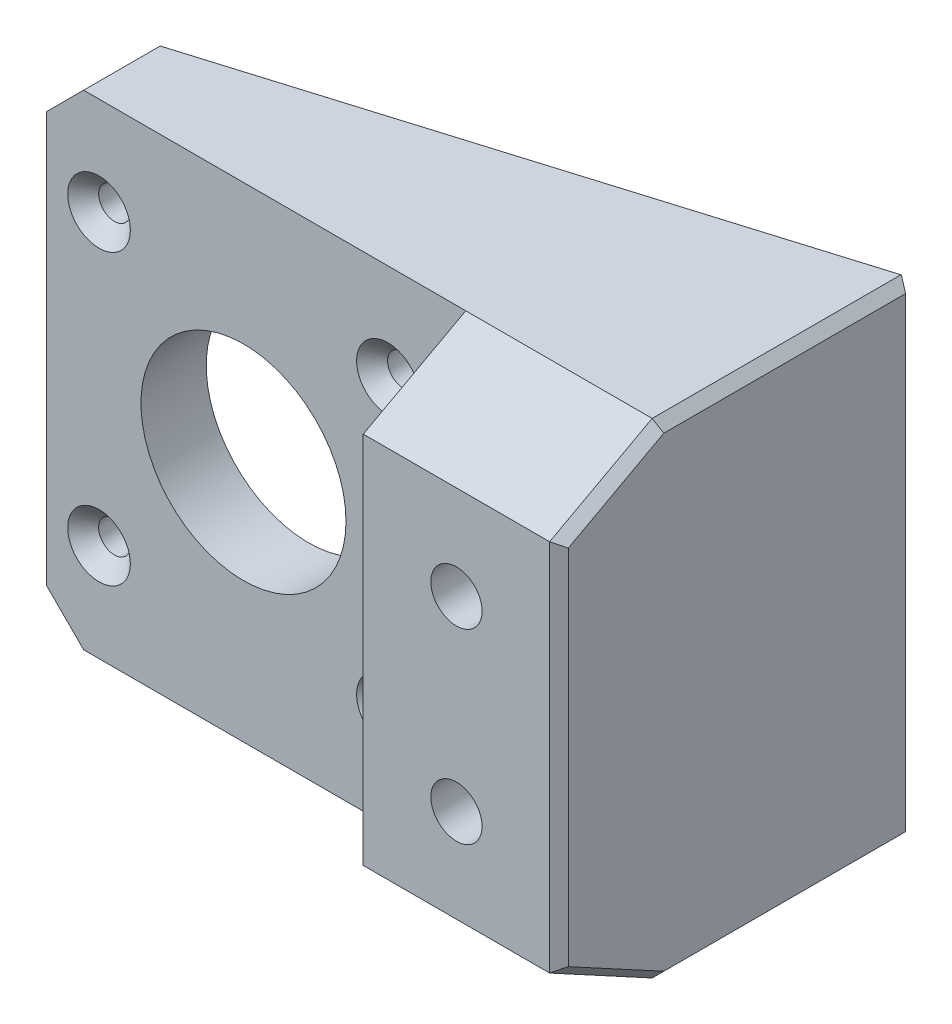
ISO-10303-21;
HEADER;
FILE_DESCRIPTION(('STEP AP214'),'2;1');
FILE_NAME('part.step','',(''),(''),'','','');
FILE_SCHEMA(('AUTOMOTIVE_DESIGN { 1 0 10303 214 1 1 1 1 }'));
ENDSEC;
DATA;
#1=APPLICATION_CONTEXT('core data for automotive mechanical design processes');
#2=APPLICATION_PROTOCOL_DEFINITION('international standard','automotive_design',2000,#1);
#3=PRODUCT_CONTEXT('',#1,'mechanical');
#4=PRODUCT('Part','Part','',(#3));
#5=PRODUCT_RELATED_PRODUCT_CATEGORY('part','',(#4));
#6=PRODUCT_DEFINITION_FORMATION('','',#4);
#7=PRODUCT_DEFINITION_CONTEXT('part definition',#1,'design');
#8=PRODUCT_DEFINITION('design','',#6,#7);
#9=PRODUCT_DEFINITION_SHAPE('','',#8);
#10=(LENGTH_UNIT() NAMED_UNIT(*) SI_UNIT(.MILLI.,.METRE.));
#11=(NAMED_UNIT(*) PLANE_ANGLE_UNIT() SI_UNIT($,.RADIAN.));
#12=(NAMED_UNIT(*) SI_UNIT($,.STERADIAN.) SOLID_ANGLE_UNIT());
#13=UNCERTAINTY_MEASURE_WITH_UNIT(LENGTH_MEASURE(1.E-05),#10,'distance_accuracy_value','');
#14=(GEOMETRIC_REPRESENTATION_CONTEXT(3) GLOBAL_UNCERTAINTY_ASSIGNED_CONTEXT((#13)) GLOBAL_UNIT_ASSIGNED_CONTEXT((#10,
#11,#12)) REPRESENTATION_CONTEXT('',''));
#15=CARTESIAN_POINT('',(0.,0.,0.));
#16=DIRECTION('',(0.,0.,1.));
#17=DIRECTION('',(1.,0.,0.));
#18=AXIS2_PLACEMENT_3D('',#15,#16,#17);
#19=CARTESIAN_POINT('',(43.5,26.,18.));
#20=DIRECTION('',(-1.,0.,0.));
#21=DIRECTION('',(0.,0.,1.));
#22=AXIS2_PLACEMENT_3D('',#19,#20,#21);
#23=PLANE('',#22);
#24=DIRECTION('',(0.,0.,-1.));
#25=VECTOR('',#24,1.);
#26=CARTESIAN_POINT('',(43.5,-25.,18.));
#27=LINE('',#26,#25);
#28=CARTESIAN_POINT('',(43.5,-25.,6.74655327699268));
#29=VERTEX_POINT('',#28);
#30=CARTESIAN_POINT('',(43.5,-25.,-19.1980958302527));
#31=VERTEX_POINT('',#30);
#32=EDGE_CURVE('E251',#29,#31,#27,.T.);
#33=ORIENTED_EDGE('',*,*,#32,.T.);
#34=DIRECTION('',(0.,1.,0.));
#35=VECTOR('',#34,1.);
#36=CARTESIAN_POINT('',(43.5,26.,-19.1980958302527));
#37=LINE('',#36,#35);
#38=CARTESIAN_POINT('',(43.5,25.,-19.1980958302527));
#39=VERTEX_POINT('',#38);
#40=EDGE_CURVE('E260',#31,#39,#37,.T.);
#41=ORIENTED_EDGE('',*,*,#40,.T.);
#42=DIRECTION('',(0.,0.,1.));
#43=VECTOR('',#42,1.);
#44=CARTESIAN_POINT('',(43.5,25.,7.));
#45=LINE('',#44,#43);
#46=CARTESIAN_POINT('',(43.5,25.,6.74655327699269));
#47=VERTEX_POINT('',#46);
#48=EDGE_CURVE('E259',#39,#47,#45,.T.);
#49=ORIENTED_EDGE('',*,*,#48,.T.);
#50=DIRECTION('',(0.,-0.476298309146684,0.879283754372848));
#51=VECTOR('',#50,1.);
#52=CARTESIAN_POINT('',(43.5,19.1621376018645,17.5237016908533));
#53=LINE('',#52,#51);
#54=CARTESIAN_POINT('',(43.5,19.4458210301209,17.));
#55=VERTEX_POINT('',#54);
#56=EDGE_CURVE('E239',#47,#55,#53,.T.);
#57=ORIENTED_EDGE('',*,*,#56,.T.);
#58=DIRECTION('',(0.,-1.,0.));
#59=VECTOR('',#58,1.);
#60=CARTESIAN_POINT('',(43.5,26.,17.));
#61=LINE('',#60,#59);
#62=CARTESIAN_POINT('',(43.5,-19.4458210301209,17.));
#63=VERTEX_POINT('',#62);
#64=EDGE_CURVE('E249',#55,#63,#61,.T.);
#65=ORIENTED_EDGE('',*,*,#64,.T.);
#66=DIRECTION('',(0.,-0.476298309146684,-0.879283754372848));
#67=VECTOR('',#66,1.);
#68=CARTESIAN_POINT('',(43.5,-8.7171771020884,36.8059118229301));
#69=LINE('',#68,#67);
#70=EDGE_CURVE('E255',#63,#29,#69,.T.);
#71=ORIENTED_EDGE('',*,*,#70,.T.);
#72=EDGE_LOOP('',(#33,#41,#49,#57,#65,#71));
#73=FACE_BOUND('',#72,.T.);
#74=ADVANCED_FACE('F43',(#73),#23,.F.);
#75=CARTESIAN_POINT('',(22.5,26.,7.));
#76=DIRECTION('',(1.,0.,0.));
#77=DIRECTION('',(0.,0.,-1.));
#78=AXIS2_PLACEMENT_3D('',#75,#76,#77);
#79=PLANE('',#78);
#80=DIRECTION('',(0.,-1.,0.));
#81=VECTOR('',#80,1.);
#82=CARTESIAN_POINT('',(22.5,26.,18.));
#83=LINE('',#82,#81);
#84=CARTESIAN_POINT('',(22.5,20.0414213562373,18.));
#85=VERTEX_POINT('',#84);
#86=CARTESIAN_POINT('',(22.5,-20.0414213562373,18.));
#87=VERTEX_POINT('',#86);
#88=EDGE_CURVE('E211',#85,#87,#83,.T.);
#89=ORIENTED_EDGE('',*,*,#88,.F.);
#90=DIRECTION('',(0.,0.476298309146684,-0.879283754372848));
#91=VECTOR('',#90,1.);
#92=CARTESIAN_POINT('',(22.5,26.,7.));
#93=LINE('',#92,#91);
#94=CARTESIAN_POINT('',(22.5,26.,7.));
#95=VERTEX_POINT('',#94);
#96=EDGE_CURVE('E199',#85,#95,#93,.T.);
#97=ORIENTED_EDGE('',*,*,#96,.T.);
#98=DIRECTION('',(0.,-1.,0.));
#99=VECTOR('',#98,1.);
#100=CARTESIAN_POINT('',(22.5,26.,7.));
#101=LINE('',#100,#99);
#102=CARTESIAN_POINT('',(22.5,-26.,7.));
#103=VERTEX_POINT('',#102);
#104=EDGE_CURVE('E208',#95,#103,#101,.T.);
#105=ORIENTED_EDGE('',*,*,#104,.T.);
#106=DIRECTION('',(0.,-0.476298309146684,-0.879283754372848));
#107=VECTOR('',#106,1.);
#108=CARTESIAN_POINT('',(22.5,-26.,7.));
#109=LINE('',#108,#107);
#110=EDGE_CURVE('E457',#87,#103,#109,.T.);
#111=ORIENTED_EDGE('',*,*,#110,.F.);
#112=EDGE_LOOP('',(#89,#97,#105,#111));
#113=FACE_BOUND('',#112,.T.);
#114=ADVANCED_FACE('F206',(#113),#79,.F.);
#115=CARTESIAN_POINT('',(22.5,26.,18.));
#116=DIRECTION('',(0.,0.,-1.));
#117=DIRECTION('',(-1.,0.,0.));
#118=AXIS2_PLACEMENT_3D('',#115,#116,#117);
#119=PLANE('',#118);
#120=CARTESIAN_POINT('',(32.4999999999999,-10.0414213562373,18.));
#121=DIRECTION('',(0.,0.,-1.));
#122=DIRECTION('',(-1.,0.,0.));
#123=AXIS2_PLACEMENT_3D('',#120,#121,#122);
#124=CIRCLE('',#123,2.75);
#125=CARTESIAN_POINT('',(29.7499999999999,-10.0414213562373,18.));
#126=VERTEX_POINT('',#125);
#127=EDGE_CURVE('E448',#126,#126,#124,.T.);
#128=ORIENTED_EDGE('',*,*,#127,.T.);
#129=EDGE_LOOP('',(#128));
#130=FACE_BOUND('',#129,.T.);
#131=CARTESIAN_POINT('',(32.4999999999999,9.95857864376272,18.));
#132=DIRECTION('',(0.,0.,-1.));
#133=DIRECTION('',(-1.,0.,0.));
#134=AXIS2_PLACEMENT_3D('',#131,#132,#133);
#135=CIRCLE('',#134,2.75);
#136=CARTESIAN_POINT('',(29.7499999999999,9.95857864376272,18.));
#137=VERTEX_POINT('',#136);
#138=EDGE_CURVE('E453',#137,#137,#135,.T.);
#139=ORIENTED_EDGE('',*,*,#138,.T.);
#140=EDGE_LOOP('',(#139));
#141=FACE_BOUND('',#140,.T.);
#142=DIRECTION('',(-1.,0.,0.));
#143=VECTOR('',#142,1.);
#144=CARTESIAN_POINT('',(43.5,-20.0414213562373,18.));
#145=LINE('',#144,#143);
#146=CARTESIAN_POINT('',(42.5,-20.0414213562373,18.));
#147=VERTEX_POINT('',#146);
#148=EDGE_CURVE('E456',#147,#87,#145,.T.);
#149=ORIENTED_EDGE('',*,*,#148,.F.);
#150=DIRECTION('',(0.,1.,0.));
#151=VECTOR('',#150,1.);
#152=CARTESIAN_POINT('',(42.5,26.,18.));
#153=LINE('',#152,#151);
#154=CARTESIAN_POINT('',(42.5,20.0414213562373,18.));
#155=VERTEX_POINT('',#154);
#156=EDGE_CURVE('E273',#147,#155,#153,.T.);
#157=ORIENTED_EDGE('',*,*,#156,.T.);
#158=DIRECTION('',(-1.,0.,0.));
#159=VECTOR('',#158,1.);
#160=CARTESIAN_POINT('',(43.5,20.0414213562373,18.));
#161=LINE('',#160,#159);
#162=EDGE_CURVE('E202',#155,#85,#161,.T.);
#163=ORIENTED_EDGE('',*,*,#162,.T.);
#164=ORIENTED_EDGE('',*,*,#88,.T.);
#165=EDGE_LOOP('',(#149,#157,#163,#164));
#166=FACE_BOUND('',#165,.T.);
#167=ADVANCED_FACE('F429',(#130,#141,#166),#119,.F.);
#168=CARTESIAN_POINT('',(-22.5,26.,0.));
#169=DIRECTION('',(1.,0.,0.));
#170=DIRECTION('',(0.,0.,-1.));
#171=AXIS2_PLACEMENT_3D('',#168,#169,#170);
#172=PLANE('',#171);
#173=DIRECTION('',(0.,-1.,0.));
#174=VECTOR('',#173,1.);
#175=CARTESIAN_POINT('',(-22.5,26.,7.));
#176=LINE('',#175,#174);
#177=CARTESIAN_POINT('',(-22.5,22.,7.));
#178=VERTEX_POINT('',#177);
#179=CARTESIAN_POINT('',(-22.5,-22.,7.));
#180=VERTEX_POINT('',#179);
#181=EDGE_CURVE('E220',#178,#180,#176,.T.);
#182=ORIENTED_EDGE('',*,*,#181,.F.);
#183=DIRECTION('',(0.,0.,-1.));
#184=VECTOR('',#183,1.);
#185=CARTESIAN_POINT('',(-22.5,22.,0.));
#186=LINE('',#185,#184);
#187=CARTESIAN_POINT('',(-22.5,22.,0.));
#188=VERTEX_POINT('',#187);
#189=EDGE_CURVE('E301',#178,#188,#186,.T.);
#190=ORIENTED_EDGE('',*,*,#189,.T.);
#191=DIRECTION('',(0.,-1.,0.));
#192=VECTOR('',#191,1.);
#193=CARTESIAN_POINT('',(-22.5,26.,0.));
#194=LINE('',#193,#192);
#195=CARTESIAN_POINT('',(-22.5,17.1398322012547,0.));
#196=VERTEX_POINT('',#195);
#197=EDGE_CURVE('E225',#188,#196,#194,.T.);
#198=ORIENTED_EDGE('',*,*,#197,.T.);
#199=CARTESIAN_POINT('',(-22.5,-17.1398322012546,0.));
#200=VERTEX_POINT('',#199);
#201=EDGE_CURVE('E331',#196,#200,#194,.T.);
#202=ORIENTED_EDGE('',*,*,#201,.T.);
#203=CARTESIAN_POINT('',(-22.5,-22.,0.));
#204=VERTEX_POINT('',#203);
#205=EDGE_CURVE('E191',#200,#204,#194,.T.);
#206=ORIENTED_EDGE('',*,*,#205,.T.);
#207=DIRECTION('',(0.,0.,1.));
#208=VECTOR('',#207,1.);
#209=CARTESIAN_POINT('',(-22.5,-22.,0.));
#210=LINE('',#209,#208);
#211=EDGE_CURVE('E296',#204,#180,#210,.T.);
#212=ORIENTED_EDGE('',*,*,#211,.T.);
#213=EDGE_LOOP('',(#182,#190,#198,#202,#206,#212));
#214=FACE_BOUND('',#213,.T.);
#215=ADVANCED_FACE('F316',(#214),#172,.F.);
#216=CARTESIAN_POINT('',(-22.5,26.,7.));
#217=DIRECTION('',(0.,0.,-1.));
#218=DIRECTION('',(-1.,0.,0.));
#219=AXIS2_PLACEMENT_3D('',#216,#217,#218);
#220=PLANE('',#219);
#221=CARTESIAN_POINT('',(-16.85,-15.5,7.));
#222=DIRECTION('',(0.,0.,1.));
#223=DIRECTION('',(1.,0.,0.));
#224=AXIS2_PLACEMENT_3D('',#221,#222,#223);
#225=CIRCLE('',#224,3.36);
#226=CARTESIAN_POINT('',(-13.49,-15.5,7.));
#227=VERTEX_POINT('',#226);
#228=EDGE_CURVE('E375',#227,#227,#225,.T.);
#229=ORIENTED_EDGE('',*,*,#228,.F.);
#230=EDGE_LOOP('',(#229));
#231=FACE_BOUND('',#230,.T.);
#232=CARTESIAN_POINT('',(-16.85,15.5,7.));
#233=DIRECTION('',(0.,0.,1.));
#234=DIRECTION('',(1.,0.,0.));
#235=AXIS2_PLACEMENT_3D('',#232,#233,#234);
#236=CIRCLE('',#235,3.36);
#237=CARTESIAN_POINT('',(-13.49,15.5,7.));
#238=VERTEX_POINT('',#237);
#239=EDGE_CURVE('E378',#238,#238,#236,.T.);
#240=ORIENTED_EDGE('',*,*,#239,.F.);
#241=EDGE_LOOP('',(#240));
#242=FACE_BOUND('',#241,.T.);
#243=CARTESIAN_POINT('',(14.15,15.5,7.));
#244=DIRECTION('',(0.,0.,1.));
#245=DIRECTION('',(1.,0.,0.));
#246=AXIS2_PLACEMENT_3D('',#243,#244,#245);
#247=CIRCLE('',#246,3.36);
#248=CARTESIAN_POINT('',(17.51,15.5,7.));
#249=VERTEX_POINT('',#248);
#250=EDGE_CURVE('E387',#249,#249,#247,.T.);
#251=ORIENTED_EDGE('',*,*,#250,.F.);
#252=EDGE_LOOP('',(#251));
#253=FACE_BOUND('',#252,.T.);
#254=CARTESIAN_POINT('',(14.15,-15.5,7.));
#255=DIRECTION('',(0.,0.,1.));
#256=DIRECTION('',(1.,0.,0.));
#257=AXIS2_PLACEMENT_3D('',#254,#255,#256);
#258=CIRCLE('',#257,3.36);
#259=CARTESIAN_POINT('',(17.51,-15.5,7.));
#260=VERTEX_POINT('',#259);
#261=EDGE_CURVE('E397',#260,#260,#258,.T.);
#262=ORIENTED_EDGE('',*,*,#261,.F.);
#263=EDGE_LOOP('',(#262));
#264=FACE_BOUND('',#263,.T.);
#265=CARTESIAN_POINT('',(-1.35000000000005,0.,7.));
#266=DIRECTION('',(0.,0.,1.));
#267=DIRECTION('',(1.,0.,0.));
#268=AXIS2_PLACEMENT_3D('',#265,#266,#267);
#269=CIRCLE('',#268,11.);
#270=CARTESIAN_POINT('',(9.64999999999995,0.,7.));
#271=VERTEX_POINT('',#270);
#272=EDGE_CURVE('E326',#271,#271,#269,.T.);
#273=ORIENTED_EDGE('',*,*,#272,.F.);
#274=EDGE_LOOP('',(#273));
#275=FACE_BOUND('',#274,.T.);
#276=DIRECTION('',(1.,0.,0.));
#277=VECTOR('',#276,1.);
#278=CARTESIAN_POINT('',(-22.5,26.,7.));
#279=LINE('',#278,#277);
#280=CARTESIAN_POINT('',(-18.5,26.,7.));
#281=VERTEX_POINT('',#280);
#282=EDGE_CURVE('E185',#281,#95,#279,.T.);
#283=ORIENTED_EDGE('',*,*,#282,.F.);
#284=DIRECTION('',(-0.707106781186546,-0.707106781186549,0.));
#285=VECTOR('',#284,1.);
#286=CARTESIAN_POINT('',(-18.5,26.,7.));
#287=LINE('',#286,#285);
#288=EDGE_CURVE('E298',#281,#178,#287,.T.);
#289=ORIENTED_EDGE('',*,*,#288,.T.);
#290=ORIENTED_EDGE('',*,*,#181,.T.);
#291=DIRECTION('',(-0.707106781186549,0.707106781186546,0.));
#292=VECTOR('',#291,1.);
#293=CARTESIAN_POINT('',(-22.5,-22.,7.));
#294=LINE('',#293,#292);
#295=CARTESIAN_POINT('',(-18.5,-26.,7.));
#296=VERTEX_POINT('',#295);
#297=EDGE_CURVE('E295',#180,#296,#294,.F.);
#298=ORIENTED_EDGE('',*,*,#297,.T.);
#299=DIRECTION('',(1.,0.,0.));
#300=VECTOR('',#299,1.);
#301=CARTESIAN_POINT('',(-22.5,-26.,7.));
#302=LINE('',#301,#300);
#303=EDGE_CURVE('E195',#296,#103,#302,.T.);
#304=ORIENTED_EDGE('',*,*,#303,.T.);
#305=ORIENTED_EDGE('',*,*,#104,.F.);
#306=EDGE_LOOP('',(#283,#289,#290,#298,#304,#305));
#307=FACE_BOUND('',#306,.T.);
#308=ADVANCED_FACE('F212',(#231,#242,#253,#264,#275,#307),#220,.F.);
#309=CARTESIAN_POINT('',(0.,26.,0.));
#310=DIRECTION('',(0.,1.,0.));
#311=DIRECTION('',(0.,0.,1.));
#312=AXIS2_PLACEMENT_3D('',#309,#310,#311);
#313=PLANE('',#312);
#314=DIRECTION('',(-0.957024404433474,0.,0.290007395282871));
#315=VECTOR('',#314,1.);
#316=CARTESIAN_POINT('',(-22.5,26.,0.));
#317=LINE('',#316,#315);
#318=CARTESIAN_POINT('',(42.5,26.,-19.6969696969697));
#319=VERTEX_POINT('',#318);
#320=CARTESIAN_POINT('',(-18.5,26.,-1.21212121212121));
#321=VERTEX_POINT('',#320);
#322=EDGE_CURVE('E310',#319,#321,#317,.T.);
#323=ORIENTED_EDGE('',*,*,#322,.T.);
#324=DIRECTION('',(0.,0.,1.));
#325=VECTOR('',#324,1.);
#326=CARTESIAN_POINT('',(-18.5,26.,7.));
#327=LINE('',#326,#325);
#328=EDGE_CURVE('E186',#321,#281,#327,.T.);
#329=ORIENTED_EDGE('',*,*,#328,.T.);
#330=ORIENTED_EDGE('',*,*,#282,.T.);
#331=DIRECTION('',(-1.,0.,0.));
#332=VECTOR('',#331,1.);
#333=CARTESIAN_POINT('',(43.5,26.,7.));
#334=LINE('',#333,#332);
#335=CARTESIAN_POINT('',(42.5,26.,7.));
#336=VERTEX_POINT('',#335);
#337=EDGE_CURVE('E187',#336,#95,#334,.T.);
#338=ORIENTED_EDGE('',*,*,#337,.F.);
#339=DIRECTION('',(0.,0.,-1.));
#340=VECTOR('',#339,1.);
#341=CARTESIAN_POINT('',(42.5,26.,-20.));
#342=LINE('',#341,#340);
#343=EDGE_CURVE('E267',#336,#319,#342,.T.);
#344=ORIENTED_EDGE('',*,*,#343,.T.);
#345=EDGE_LOOP('',(#323,#329,#330,#338,#344));
#346=FACE_BOUND('',#345,.T.);
#347=ADVANCED_FACE('F184',(#346),#313,.T.);
#348=CARTESIAN_POINT('',(0.,-26.,0.));
#349=DIRECTION('',(0.,1.,0.));
#350=DIRECTION('',(0.,0.,1.));
#351=AXIS2_PLACEMENT_3D('',#348,#349,#350);
#352=PLANE('',#351);
#353=ORIENTED_EDGE('',*,*,#303,.F.);
#354=DIRECTION('',(0.,0.,-1.));
#355=VECTOR('',#354,1.);
#356=CARTESIAN_POINT('',(-18.5,-26.,0.));
#357=LINE('',#356,#355);
#358=CARTESIAN_POINT('',(-18.5,-26.,-1.21212121212122));
#359=VERTEX_POINT('',#358);
#360=EDGE_CURVE('E11',#296,#359,#357,.T.);
#361=ORIENTED_EDGE('',*,*,#360,.T.);
#362=DIRECTION('',(0.957024404433473,0.,-0.290007395282871));
#363=VECTOR('',#362,1.);
#364=CARTESIAN_POINT('',(-22.5,-26.,0.));
#365=LINE('',#364,#363);
#366=CARTESIAN_POINT('',(42.5,-26.,-19.6969696969697));
#367=VERTEX_POINT('',#366);
#368=EDGE_CURVE('E312',#359,#367,#365,.T.);
#369=ORIENTED_EDGE('',*,*,#368,.T.);
#370=DIRECTION('',(0.,0.,1.));
#371=VECTOR('',#370,1.);
#372=CARTESIAN_POINT('',(42.5,-26.,0.));
#373=LINE('',#372,#371);
#374=CARTESIAN_POINT('',(42.5,-26.,7.));
#375=VERTEX_POINT('',#374);
#376=EDGE_CURVE('E272',#367,#375,#373,.T.);
#377=ORIENTED_EDGE('',*,*,#376,.T.);
#378=DIRECTION('',(-1.,0.,0.));
#379=VECTOR('',#378,1.);
#380=CARTESIAN_POINT('',(43.5,-26.,7.));
#381=LINE('',#380,#379);
#382=EDGE_CURVE('E244',#375,#103,#381,.T.);
#383=ORIENTED_EDGE('',*,*,#382,.T.);
#384=EDGE_LOOP('',(#353,#361,#369,#377,#383));
#385=FACE_BOUND('',#384,.T.);
#386=ADVANCED_FACE('F325',(#385),#352,.F.);
#387=CARTESIAN_POINT('',(-1.35000000000005,0.,0.));
#388=DIRECTION('',(0.,0.,1.));
#389=DIRECTION('',(1.,0.,0.));
#390=AXIS2_PLACEMENT_3D('',#387,#388,#389);
#391=CYLINDRICAL_SURFACE('',#390,11.);
#392=CARTESIAN_POINT('',(-1.35000000000005,0.,0.));
#393=DIRECTION('',(0.,0.,1.));
#394=DIRECTION('',(1.,0.,0.));
#395=AXIS2_PLACEMENT_3D('',#392,#393,#394);
#396=CIRCLE('',#395,11.);
#397=CARTESIAN_POINT('',(9.64999999999995,0.,0.));
#398=VERTEX_POINT('',#397);
#399=EDGE_CURVE('E313',#398,#398,#396,.T.);
#400=ORIENTED_EDGE('',*,*,#399,.F.);
#401=EDGE_LOOP('',(#400));
#402=FACE_BOUND('',#401,.T.);
#403=ORIENTED_EDGE('',*,*,#272,.T.);
#404=EDGE_LOOP('',(#403));
#405=FACE_BOUND('',#404,.T.);
#406=ADVANCED_FACE('F412',(#402,#405),#391,.F.);
#407=CARTESIAN_POINT('',(14.15,-15.5,7.));
#408=DIRECTION('',(0.,0.,1.));
#409=DIRECTION('',(1.,0.,0.));
#410=AXIS2_PLACEMENT_3D('',#407,#408,#409);
#411=CYLINDRICAL_SURFACE('',#410,1.7);
#412=CARTESIAN_POINT('',(14.15,-15.5,0.));
#413=DIRECTION('',(0.,0.,1.));
#414=DIRECTION('',(1.,0.,0.));
#415=AXIS2_PLACEMENT_3D('',#412,#413,#414);
#416=CIRCLE('',#415,1.7);
#417=CARTESIAN_POINT('',(15.85,-15.5,0.));
#418=VERTEX_POINT('',#417);
#419=EDGE_CURVE('E405',#418,#418,#416,.T.);
#420=ORIENTED_EDGE('',*,*,#419,.F.);
#421=EDGE_LOOP('',(#420));
#422=FACE_BOUND('',#421,.T.);
#423=CARTESIAN_POINT('',(14.15,-15.5,5.34));
#424=DIRECTION('',(0.,0.,1.));
#425=DIRECTION('',(1.,0.,0.));
#426=AXIS2_PLACEMENT_3D('',#423,#424,#425);
#427=CIRCLE('',#426,1.7);
#428=CARTESIAN_POINT('',(15.85,-15.5,5.34));
#429=VERTEX_POINT('',#428);
#430=EDGE_CURVE('E327',#429,#429,#427,.T.);
#431=ORIENTED_EDGE('',*,*,#430,.T.);
#432=EDGE_LOOP('',(#431));
#433=FACE_BOUND('',#432,.T.);
#434=ADVANCED_FACE('F420',(#422,#433),#411,.F.);
#435=CARTESIAN_POINT('',(14.15,-15.5,7.));
#436=DIRECTION('',(0.,0.,1.));
#437=DIRECTION('',(1.,0.,0.));
#438=AXIS2_PLACEMENT_3D('',#435,#436,#437);
#439=CONICAL_SURFACE('',#438,3.36,0.785398163397448);
#440=ORIENTED_EDGE('',*,*,#430,.F.);
#441=EDGE_LOOP('',(#440));
#442=FACE_BOUND('',#441,.T.);
#443=ORIENTED_EDGE('',*,*,#261,.T.);
#444=EDGE_LOOP('',(#443));
#445=FACE_BOUND('',#444,.T.);
#446=ADVANCED_FACE('F571',(#442,#445),#439,.F.);
#447=CARTESIAN_POINT('',(14.15,15.5,7.));
#448=DIRECTION('',(0.,0.,1.));
#449=DIRECTION('',(1.,0.,0.));
#450=AXIS2_PLACEMENT_3D('',#447,#448,#449);
#451=CYLINDRICAL_SURFACE('',#450,1.7);
#452=CARTESIAN_POINT('',(14.15,15.5,0.));
#453=DIRECTION('',(0.,0.,1.));
#454=DIRECTION('',(1.,0.,0.));
#455=AXIS2_PLACEMENT_3D('',#452,#453,#454);
#456=CIRCLE('',#455,1.7);
#457=CARTESIAN_POINT('',(15.85,15.5,0.));
#458=VERTEX_POINT('',#457);
#459=EDGE_CURVE('E393',#458,#458,#456,.T.);
#460=ORIENTED_EDGE('',*,*,#459,.F.);
#461=EDGE_LOOP('',(#460));
#462=FACE_BOUND('',#461,.T.);
#463=CARTESIAN_POINT('',(14.15,15.5,5.34));
#464=DIRECTION('',(0.,0.,1.));
#465=DIRECTION('',(1.,0.,0.));
#466=AXIS2_PLACEMENT_3D('',#463,#464,#465);
#467=CIRCLE('',#466,1.7);
#468=CARTESIAN_POINT('',(15.85,15.5,5.34));
#469=VERTEX_POINT('',#468);
#470=EDGE_CURVE('E396',#469,#469,#467,.T.);
#471=ORIENTED_EDGE('',*,*,#470,.T.);
#472=EDGE_LOOP('',(#471));
#473=FACE_BOUND('',#472,.T.);
#474=ADVANCED_FACE('F570',(#462,#473),#451,.F.);
#475=CARTESIAN_POINT('',(14.15,15.5,7.));
#476=DIRECTION('',(0.,0.,1.));
#477=DIRECTION('',(1.,0.,0.));
#478=AXIS2_PLACEMENT_3D('',#475,#476,#477);
#479=CONICAL_SURFACE('',#478,3.36,0.785398163397448);
#480=ORIENTED_EDGE('',*,*,#470,.F.);
#481=EDGE_LOOP('',(#480));
#482=FACE_BOUND('',#481,.T.);
#483=ORIENTED_EDGE('',*,*,#250,.T.);
#484=EDGE_LOOP('',(#483));
#485=FACE_BOUND('',#484,.T.);
#486=ADVANCED_FACE('F563',(#482,#485),#479,.F.);
#487=CARTESIAN_POINT('',(-16.85,15.5,7.));
#488=DIRECTION('',(0.,0.,1.));
#489=DIRECTION('',(1.,0.,0.));
#490=AXIS2_PLACEMENT_3D('',#487,#488,#489);
#491=CYLINDRICAL_SURFACE('',#490,1.7);
#492=CARTESIAN_POINT('',(-16.85,15.5,0.));
#493=DIRECTION('',(0.,0.,1.));
#494=DIRECTION('',(1.,0.,0.));
#495=AXIS2_PLACEMENT_3D('',#492,#493,#494);
#496=CIRCLE('',#495,1.7);
#497=CARTESIAN_POINT('',(-15.15,15.5,0.));
#498=VERTEX_POINT('',#497);
#499=EDGE_CURVE('E384',#498,#498,#496,.T.);
#500=ORIENTED_EDGE('',*,*,#499,.F.);
#501=EDGE_LOOP('',(#500));
#502=FACE_BOUND('',#501,.T.);
#503=CARTESIAN_POINT('',(-16.85,15.5,5.34));
#504=DIRECTION('',(0.,0.,1.));
#505=DIRECTION('',(1.,0.,0.));
#506=AXIS2_PLACEMENT_3D('',#503,#504,#505);
#507=CIRCLE('',#506,1.7);
#508=CARTESIAN_POINT('',(-15.15,15.5,5.34));
#509=VERTEX_POINT('',#508);
#510=EDGE_CURVE('E386',#509,#509,#507,.T.);
#511=ORIENTED_EDGE('',*,*,#510,.T.);
#512=EDGE_LOOP('',(#511));
#513=FACE_BOUND('',#512,.T.);
#514=ADVANCED_FACE('F559',(#502,#513),#491,.F.);
#515=CARTESIAN_POINT('',(-16.85,15.5,7.));
#516=DIRECTION('',(0.,0.,1.));
#517=DIRECTION('',(1.,0.,0.));
#518=AXIS2_PLACEMENT_3D('',#515,#516,#517);
#519=CONICAL_SURFACE('',#518,3.36,0.785398163397447);
#520=ORIENTED_EDGE('',*,*,#510,.F.);
#521=EDGE_LOOP('',(#520));
#522=FACE_BOUND('',#521,.T.);
#523=ORIENTED_EDGE('',*,*,#239,.T.);
#524=EDGE_LOOP('',(#523));
#525=FACE_BOUND('',#524,.T.);
#526=ADVANCED_FACE('F554',(#522,#525),#519,.F.);
#527=CARTESIAN_POINT('',(-16.85,-15.5,7.));
#528=DIRECTION('',(0.,0.,1.));
#529=DIRECTION('',(1.,0.,0.));
#530=AXIS2_PLACEMENT_3D('',#527,#528,#529);
#531=CYLINDRICAL_SURFACE('',#530,1.7);
#532=CARTESIAN_POINT('',(-16.85,-15.5,0.));
#533=DIRECTION('',(0.,0.,1.));
#534=DIRECTION('',(1.,0.,0.));
#535=AXIS2_PLACEMENT_3D('',#532,#533,#534);
#536=CIRCLE('',#535,1.7);
#537=CARTESIAN_POINT('',(-15.15,-15.5,0.));
#538=VERTEX_POINT('',#537);
#539=EDGE_CURVE('E379',#538,#538,#536,.T.);
#540=ORIENTED_EDGE('',*,*,#539,.F.);
#541=EDGE_LOOP('',(#540));
#542=FACE_BOUND('',#541,.T.);
#543=CARTESIAN_POINT('',(-16.85,-15.5,5.34));
#544=DIRECTION('',(0.,0.,1.));
#545=DIRECTION('',(1.,0.,0.));
#546=AXIS2_PLACEMENT_3D('',#543,#544,#545);
#547=CIRCLE('',#546,1.7);
#548=CARTESIAN_POINT('',(-15.15,-15.5,5.34));
#549=VERTEX_POINT('',#548);
#550=EDGE_CURVE('E376',#549,#549,#547,.T.);
#551=ORIENTED_EDGE('',*,*,#550,.T.);
#552=EDGE_LOOP('',(#551));
#553=FACE_BOUND('',#552,.T.);
#554=ADVANCED_FACE('F553',(#542,#553),#531,.F.);
#555=CARTESIAN_POINT('',(-16.85,-15.5,7.));
#556=DIRECTION('',(0.,0.,1.));
#557=DIRECTION('',(1.,0.,0.));
#558=AXIS2_PLACEMENT_3D('',#555,#556,#557);
#559=CONICAL_SURFACE('',#558,3.36,0.785398163397447);
#560=ORIENTED_EDGE('',*,*,#550,.F.);
#561=EDGE_LOOP('',(#560));
#562=FACE_BOUND('',#561,.T.);
#563=ORIENTED_EDGE('',*,*,#228,.T.);
#564=EDGE_LOOP('',(#563));
#565=FACE_BOUND('',#564,.T.);
#566=ADVANCED_FACE('F550',(#562,#565),#559,.F.);
#567=CARTESIAN_POINT('',(-22.5,-94.9637585982667,0.));
#568=DIRECTION('',(-0.290007395282871,0.,-0.957024404433473));
#569=DIRECTION('',(-0.957024404433473,0.,0.290007395282871));
#570=AXIS2_PLACEMENT_3D('',#567,#568,#569);
#571=PLANE('',#570);
#572=CARTESIAN_POINT('',(32.4999999999999,-10.0414213562373,-16.6666666666667));
#573=DIRECTION('',(-0.290007395282871,0.,-0.957024404433473));
#574=DIRECTION('',(-0.957024404433473,0.,0.290007395282871));
#575=AXIS2_PLACEMENT_3D('',#572,#573,#574);
#576=ELLIPSE('',#575,5.22452716653535,5.);
#577=CARTESIAN_POINT('',(27.4999999999999,-10.0414213562373,-15.1515151515151));
#578=VERTEX_POINT('',#577);
#579=EDGE_CURVE('E242',#578,#578,#576,.T.);
#580=ORIENTED_EDGE('',*,*,#579,.F.);
#581=EDGE_LOOP('',(#580));
#582=FACE_BOUND('',#581,.T.);
#583=CARTESIAN_POINT('',(32.4999999999999,9.95857864376272,-16.6666666666666));
#584=DIRECTION('',(-0.290007395282871,0.,-0.957024404433473));
#585=DIRECTION('',(-0.957024404433473,0.,0.290007395282871));
#586=AXIS2_PLACEMENT_3D('',#583,#584,#585);
#587=ELLIPSE('',#586,5.22452716653535,5.);
#588=CARTESIAN_POINT('',(27.4999999999999,9.95857864376272,-15.1515151515151));
#589=VERTEX_POINT('',#588);
#590=EDGE_CURVE('E241',#589,#589,#587,.T.);
#591=ORIENTED_EDGE('',*,*,#590,.F.);
#592=EDGE_LOOP('',(#591));
#593=FACE_BOUND('',#592,.T.);
#594=ORIENTED_EDGE('',*,*,#197,.F.);
#595=DIRECTION('',(0.691412266206841,0.691412266206844,-0.209518868547528));
#596=VECTOR('',#595,1.);
#597=CARTESIAN_POINT('',(-78.4146326222618,-33.914632622262,16.9438280673521));
#598=LINE('',#597,#596);
#599=EDGE_CURVE('E55',#188,#321,#598,.T.);
#600=ORIENTED_EDGE('',*,*,#599,.T.);
#601=ORIENTED_EDGE('',*,*,#322,.F.);
#602=DIRECTION('',(0.691412266206844,-0.691412266206841,-0.209518868547528));
#603=VECTOR('',#602,1.);
#604=CARTESIAN_POINT('',(66.4001462306901,2.09985376930995,-26.9394382517243));
#605=LINE('',#604,#603);
#606=CARTESIAN_POINT('',(42.5429755955665,25.9570244044335,-19.7099926047171));
#607=VERTEX_POINT('',#606);
#608=EDGE_CURVE('E270',#319,#607,#605,.T.);
#609=ORIENTED_EDGE('',*,*,#608,.T.);
#610=DIRECTION('',(0.,-1.,0.));
#611=VECTOR('',#610,1.);
#612=CARTESIAN_POINT('',(42.5429755955665,-26.,-19.7099926047171));
#613=LINE('',#612,#611);
#614=CARTESIAN_POINT('',(42.5429755955665,-25.9570244044335,-19.7099926047171));
#615=VERTEX_POINT('',#614);
#616=EDGE_CURVE('E262',#607,#615,#613,.T.);
#617=ORIENTED_EDGE('',*,*,#616,.T.);
#618=DIRECTION('',(0.691412266206845,0.69141226620684,-0.209518868547529));
#619=VECTOR('',#618,1.);
#620=CARTESIAN_POINT('',(-24.3948784519372,-92.8948784519367,0.574205591496119));
#621=LINE('',#620,#619);
#622=EDGE_CURVE('E261',#615,#367,#621,.F.);
#623=ORIENTED_EDGE('',*,*,#622,.T.);
#624=ORIENTED_EDGE('',*,*,#368,.F.);
#625=DIRECTION('',(0.691412266206844,-0.691412266206841,-0.209518868547528));
#626=VECTOR('',#625,1.);
#627=CARTESIAN_POINT('',(12.3803920603654,-56.8803920603653,-10.5698157758683));
#628=LINE('',#627,#626);
#629=EDGE_CURVE('E63',#359,#204,#628,.F.);
#630=ORIENTED_EDGE('',*,*,#629,.T.);
#631=ORIENTED_EDGE('',*,*,#205,.F.);
#632=DIRECTION('',(-0.691412266206843,0.691412266206843,0.209518868547528));
#633=VECTOR('',#632,1.);
#634=CARTESIAN_POINT('',(14.7037997569561,-54.3436319582108,-11.2738787142291));
#635=LINE('',#634,#633);
#636=CARTESIAN_POINT('',(-18.4398322012547,-21.2,-1.23035387840767));
#637=VERTEX_POINT('',#636);
#638=EDGE_CURVE('E240',#637,#200,#635,.T.);
#639=ORIENTED_EDGE('',*,*,#638,.F.);
#640=DIRECTION('',(-0.957024404433473,0.,0.290007395282871));
#641=VECTOR('',#640,1.);
#642=CARTESIAN_POINT('',(-22.5,-21.2,0.));
#643=LINE('',#642,#641);
#644=CARTESIAN_POINT('',(15.7398322012546,-21.2,-11.5878279397741));
#645=VERTEX_POINT('',#644);
#646=EDGE_CURVE('E232',#645,#637,#643,.T.);
#647=ORIENTED_EDGE('',*,*,#646,.F.);
#648=DIRECTION('',(-0.691412266206843,-0.691412266206843,0.209518868547528));
#649=VECTOR('',#648,1.);
#650=CARTESIAN_POINT('',(-39.482245762224,-76.4220779634785,5.14613507946181));
#651=LINE('',#650,#649);
#652=CARTESIAN_POINT('',(19.85,-17.0898322012546,-12.8333333333333));
#653=VERTEX_POINT('',#652);
#654=EDGE_CURVE('E231',#653,#645,#651,.T.);
#655=ORIENTED_EDGE('',*,*,#654,.F.);
#656=DIRECTION('',(0.,-1.,0.));
#657=VECTOR('',#656,1.);
#658=CARTESIAN_POINT('',(19.85,-94.9637585982667,-12.8333333333333));
#659=LINE('',#658,#657);
#660=CARTESIAN_POINT('',(19.85,17.0898322012547,-12.8333333333333));
#661=VERTEX_POINT('',#660);
#662=EDGE_CURVE('E219',#661,#653,#659,.T.);
#663=ORIENTED_EDGE('',*,*,#662,.F.);
#664=DIRECTION('',(0.691412266206843,-0.691412266206843,-0.209518868547528));
#665=VECTOR('',#664,1.);
#666=CARTESIAN_POINT('',(51.3127789204033,-14.3729467191487,-22.3675087637586));
#667=LINE('',#666,#665);
#668=CARTESIAN_POINT('',(15.7398322012546,21.2,-11.5878279397741));
#669=VERTEX_POINT('',#668);
#670=EDGE_CURVE('E227',#669,#661,#667,.T.);
#671=ORIENTED_EDGE('',*,*,#670,.F.);
#672=DIRECTION('',(0.957024404433473,0.,-0.290007395282871));
#673=VECTOR('',#672,1.);
#674=CARTESIAN_POINT('',(-22.5,21.2,0.));
#675=LINE('',#674,#673);
#676=CARTESIAN_POINT('',(-18.4398322012547,21.2,-1.23035387840767));
#677=VERTEX_POINT('',#676);
#678=EDGE_CURVE('E230',#677,#669,#675,.T.);
#679=ORIENTED_EDGE('',*,*,#678,.F.);
#680=DIRECTION('',(0.691412266206843,0.691412266206843,-0.209518868547528));
#681=VECTOR('',#680,1.);
#682=CARTESIAN_POINT('',(-76.0912249256711,-36.4513927244164,16.2397651289913));
#683=LINE('',#682,#681);
#684=EDGE_CURVE('E233',#196,#677,#683,.T.);
#685=ORIENTED_EDGE('',*,*,#684,.F.);
#686=EDGE_LOOP('',(#594,#600,#601,#609,#617,#623,#624,#630,#631,#639,#647,#655,#663,#671,#679,#685));
#687=FACE_BOUND('',#686,.T.);
#688=ADVANCED_FACE('F306',(#582,#593,#687),#571,.T.);
#689=CARTESIAN_POINT('',(15.7398322012546,-21.2,-20.));
#690=DIRECTION('',(0.707106781186548,-0.707106781186548,0.));
#691=DIRECTION('',(0.707106781186548,0.707106781186548,0.));
#692=AXIS2_PLACEMENT_3D('',#689,#690,#691);
#693=PLANE('',#692);
#694=ORIENTED_EDGE('',*,*,#654,.T.);
#695=DIRECTION('',(0.,0.,1.));
#696=VECTOR('',#695,1.);
#697=CARTESIAN_POINT('',(15.7398322012546,-21.2,-20.));
#698=LINE('',#697,#696);
#699=CARTESIAN_POINT('',(15.7398322012546,-21.2,0.));
#700=VERTEX_POINT('',#699);
#701=EDGE_CURVE('E381',#645,#700,#698,.T.);
#702=ORIENTED_EDGE('',*,*,#701,.T.);
#703=DIRECTION('',(0.707106781186547,0.707106781186547,0.));
#704=VECTOR('',#703,1.);
#705=CARTESIAN_POINT('',(15.7398322012546,-21.2,0.));
#706=LINE('',#705,#704);
#707=CARTESIAN_POINT('',(19.85,-17.0898322012546,0.));
#708=VERTEX_POINT('',#707);
#709=EDGE_CURVE('E504',#700,#708,#706,.T.);
#710=ORIENTED_EDGE('',*,*,#709,.T.);
#711=DIRECTION('',(0.,0.,1.));
#712=VECTOR('',#711,1.);
#713=CARTESIAN_POINT('',(19.85,-17.0898322012546,-20.));
#714=LINE('',#713,#712);
#715=EDGE_CURVE('E366',#653,#708,#714,.T.);
#716=ORIENTED_EDGE('',*,*,#715,.F.);
#717=EDGE_LOOP('',(#694,#702,#710,#716));
#718=FACE_BOUND('',#717,.T.);
#719=ADVANCED_FACE('F528',(#718),#693,.F.);
#720=CARTESIAN_POINT('',(-18.4398322012547,-21.2,-20.));
#721=DIRECTION('',(0.,-1.,0.));
#722=DIRECTION('',(0.,0.,-1.));
#723=AXIS2_PLACEMENT_3D('',#720,#721,#722);
#724=PLANE('',#723);
#725=ORIENTED_EDGE('',*,*,#646,.T.);
#726=DIRECTION('',(0.,0.,1.));
#727=VECTOR('',#726,1.);
#728=CARTESIAN_POINT('',(-18.4398322012547,-21.2,-20.));
#729=LINE('',#728,#727);
#730=CARTESIAN_POINT('',(-18.4398322012547,-21.2,0.));
#731=VERTEX_POINT('',#730);
#732=EDGE_CURVE('E364',#637,#731,#729,.T.);
#733=ORIENTED_EDGE('',*,*,#732,.T.);
#734=DIRECTION('',(1.,0.,0.));
#735=VECTOR('',#734,1.);
#736=CARTESIAN_POINT('',(-18.4398322012547,-21.2,0.));
#737=LINE('',#736,#735);
#738=EDGE_CURVE('E371',#731,#700,#737,.T.);
#739=ORIENTED_EDGE('',*,*,#738,.T.);
#740=ORIENTED_EDGE('',*,*,#701,.F.);
#741=EDGE_LOOP('',(#725,#733,#739,#740));
#742=FACE_BOUND('',#741,.T.);
#743=ADVANCED_FACE('F520',(#742),#724,.F.);
#744=CARTESIAN_POINT('',(-22.5500000000001,-17.0898322012546,-20.));
#745=DIRECTION('',(-0.707106781186548,-0.707106781186548,0.));
#746=DIRECTION('',(0.707106781186548,-0.707106781186548,0.));
#747=AXIS2_PLACEMENT_3D('',#744,#745,#746);
#748=PLANE('',#747);
#749=ORIENTED_EDGE('',*,*,#638,.T.);
#750=DIRECTION('',(0.707106781186547,-0.707106781186547,0.));
#751=VECTOR('',#750,1.);
#752=CARTESIAN_POINT('',(-22.5500000000001,-17.0898322012546,0.));
#753=LINE('',#752,#751);
#754=EDGE_CURVE('E341',#200,#731,#753,.T.);
#755=ORIENTED_EDGE('',*,*,#754,.T.);
#756=ORIENTED_EDGE('',*,*,#732,.F.);
#757=EDGE_LOOP('',(#749,#755,#756));
#758=FACE_BOUND('',#757,.T.);
#759=ADVANCED_FACE('F523',(#758),#748,.F.);
#760=CARTESIAN_POINT('',(-18.4398322012547,21.2,-20.));
#761=DIRECTION('',(-0.707106781186548,0.707106781186548,0.));
#762=DIRECTION('',(-0.707106781186548,-0.707106781186548,0.));
#763=AXIS2_PLACEMENT_3D('',#760,#761,#762);
#764=PLANE('',#763);
#765=ORIENTED_EDGE('',*,*,#684,.T.);
#766=DIRECTION('',(0.,0.,1.));
#767=VECTOR('',#766,1.);
#768=CARTESIAN_POINT('',(-18.4398322012547,21.2,-20.));
#769=LINE('',#768,#767);
#770=CARTESIAN_POINT('',(-18.4398322012547,21.2,0.));
#771=VERTEX_POINT('',#770);
#772=EDGE_CURVE('E346',#677,#771,#769,.T.);
#773=ORIENTED_EDGE('',*,*,#772,.T.);
#774=DIRECTION('',(-0.707106781186547,-0.707106781186547,0.));
#775=VECTOR('',#774,1.);
#776=CARTESIAN_POINT('',(-18.4398322012547,21.2,0.));
#777=LINE('',#776,#775);
#778=EDGE_CURVE('E336',#771,#196,#777,.T.);
#779=ORIENTED_EDGE('',*,*,#778,.T.);
#780=EDGE_LOOP('',(#765,#773,#779));
#781=FACE_BOUND('',#780,.T.);
#782=ADVANCED_FACE('F343',(#781),#764,.F.);
#783=CARTESIAN_POINT('',(15.7398322012546,21.2,-20.));
#784=DIRECTION('',(0.,1.,0.));
#785=DIRECTION('',(0.,0.,1.));
#786=AXIS2_PLACEMENT_3D('',#783,#784,#785);
#787=PLANE('',#786);
#788=ORIENTED_EDGE('',*,*,#678,.T.);
#789=DIRECTION('',(0.,0.,1.));
#790=VECTOR('',#789,1.);
#791=CARTESIAN_POINT('',(15.7398322012546,21.2,-20.));
#792=LINE('',#791,#790);
#793=CARTESIAN_POINT('',(15.7398322012546,21.2,0.));
#794=VERTEX_POINT('',#793);
#795=EDGE_CURVE('E354',#669,#794,#792,.T.);
#796=ORIENTED_EDGE('',*,*,#795,.T.);
#797=DIRECTION('',(-1.,0.,0.));
#798=VECTOR('',#797,1.);
#799=CARTESIAN_POINT('',(15.7398322012546,21.2,0.));
#800=LINE('',#799,#798);
#801=EDGE_CURVE('E350',#794,#771,#800,.T.);
#802=ORIENTED_EDGE('',*,*,#801,.T.);
#803=ORIENTED_EDGE('',*,*,#772,.F.);
#804=EDGE_LOOP('',(#788,#796,#802,#803));
#805=FACE_BOUND('',#804,.T.);
#806=ADVANCED_FACE('F352',(#805),#787,.F.);
#807=CARTESIAN_POINT('',(19.85,17.0898322012547,-20.));
#808=DIRECTION('',(0.707106781186548,0.707106781186548,0.));
#809=DIRECTION('',(-0.707106781186548,0.707106781186548,0.));
#810=AXIS2_PLACEMENT_3D('',#807,#808,#809);
#811=PLANE('',#810);
#812=ORIENTED_EDGE('',*,*,#670,.T.);
#813=DIRECTION('',(0.,0.,1.));
#814=VECTOR('',#813,1.);
#815=CARTESIAN_POINT('',(19.85,17.0898322012547,-20.));
#816=LINE('',#815,#814);
#817=CARTESIAN_POINT('',(19.85,17.0898322012547,0.));
#818=VERTEX_POINT('',#817);
#819=EDGE_CURVE('E365',#661,#818,#816,.T.);
#820=ORIENTED_EDGE('',*,*,#819,.T.);
#821=DIRECTION('',(-0.707106781186547,0.707106781186547,0.));
#822=VECTOR('',#821,1.);
#823=CARTESIAN_POINT('',(19.85,17.0898322012547,0.));
#824=LINE('',#823,#822);
#825=EDGE_CURVE('E363',#818,#794,#824,.T.);
#826=ORIENTED_EDGE('',*,*,#825,.T.);
#827=ORIENTED_EDGE('',*,*,#795,.F.);
#828=EDGE_LOOP('',(#812,#820,#826,#827));
#829=FACE_BOUND('',#828,.T.);
#830=ADVANCED_FACE('F356',(#829),#811,.F.);
#831=CARTESIAN_POINT('',(19.85,-17.0898322012546,-20.));
#832=DIRECTION('',(1.,0.,0.));
#833=DIRECTION('',(0.,0.,-1.));
#834=AXIS2_PLACEMENT_3D('',#831,#832,#833);
#835=PLANE('',#834);
#836=ORIENTED_EDGE('',*,*,#662,.T.);
#837=ORIENTED_EDGE('',*,*,#715,.T.);
#838=DIRECTION('',(0.,1.,0.));
#839=VECTOR('',#838,1.);
#840=CARTESIAN_POINT('',(19.85,-17.0898322012546,0.));
#841=LINE('',#840,#839);
#842=EDGE_CURVE('E507',#708,#818,#841,.T.);
#843=ORIENTED_EDGE('',*,*,#842,.T.);
#844=ORIENTED_EDGE('',*,*,#819,.F.);
#845=EDGE_LOOP('',(#836,#837,#843,#844));
#846=FACE_BOUND('',#845,.T.);
#847=ADVANCED_FACE('F532',(#846),#835,.F.);
#848=CARTESIAN_POINT('',(0.,0.,0.));
#849=DIRECTION('',(0.,0.,1.));
#850=DIRECTION('',(1.,0.,0.));
#851=AXIS2_PLACEMENT_3D('',#848,#849,#850);
#852=PLANE('',#851);
#853=ORIENTED_EDGE('',*,*,#399,.T.);
#854=EDGE_LOOP('',(#853));
#855=FACE_BOUND('',#854,.T.);
#856=ORIENTED_EDGE('',*,*,#419,.T.);
#857=EDGE_LOOP('',(#856));
#858=FACE_BOUND('',#857,.T.);
#859=ORIENTED_EDGE('',*,*,#459,.T.);
#860=EDGE_LOOP('',(#859));
#861=FACE_BOUND('',#860,.T.);
#862=ORIENTED_EDGE('',*,*,#499,.T.);
#863=EDGE_LOOP('',(#862));
#864=FACE_BOUND('',#863,.T.);
#865=ORIENTED_EDGE('',*,*,#539,.T.);
#866=EDGE_LOOP('',(#865));
#867=FACE_BOUND('',#866,.T.);
#868=ORIENTED_EDGE('',*,*,#201,.F.);
#869=ORIENTED_EDGE('',*,*,#778,.F.);
#870=ORIENTED_EDGE('',*,*,#801,.F.);
#871=ORIENTED_EDGE('',*,*,#825,.F.);
#872=ORIENTED_EDGE('',*,*,#842,.F.);
#873=ORIENTED_EDGE('',*,*,#709,.F.);
#874=ORIENTED_EDGE('',*,*,#738,.F.);
#875=ORIENTED_EDGE('',*,*,#754,.F.);
#876=EDGE_LOOP('',(#868,#869,#870,#871,#872,#873,#874,#875));
#877=FACE_BOUND('',#876,.T.);
#878=ADVANCED_FACE('F337',(#855,#858,#861,#864,#867,#877),#852,.F.);
#879=CARTESIAN_POINT('',(32.4999999999999,-10.0414213562373,0.));
#880=DIRECTION('',(0.,0.,-1.));
#881=DIRECTION('',(-1.,0.,0.));
#882=AXIS2_PLACEMENT_3D('',#879,#880,#881);
#883=CYLINDRICAL_SURFACE('',#882,2.75);
#884=ORIENTED_EDGE('',*,*,#127,.F.);
#885=EDGE_LOOP('',(#884));
#886=FACE_BOUND('',#885,.T.);
#887=CARTESIAN_POINT('',(32.4999999999999,-10.0414213562373,5.));
#888=DIRECTION('',(0.,0.,-1.));
#889=DIRECTION('',(-1.,0.,0.));
#890=AXIS2_PLACEMENT_3D('',#887,#888,#889);
#891=CIRCLE('',#890,2.75);
#892=CARTESIAN_POINT('',(29.7499999999999,-10.0414213562373,5.));
#893=VERTEX_POINT('',#892);
#894=EDGE_CURVE('E501',#893,#893,#891,.T.);
#895=ORIENTED_EDGE('',*,*,#894,.T.);
#896=EDGE_LOOP('',(#895));
#897=FACE_BOUND('',#896,.T.);
#898=ADVANCED_FACE('F540',(#886,#897),#883,.F.);
#899=CARTESIAN_POINT('',(35.2499999999999,-10.0414213562373,5.));
#900=DIRECTION('',(0.,0.,1.));
#901=DIRECTION('',(1.,0.,0.));
#902=AXIS2_PLACEMENT_3D('',#899,#900,#901);
#903=PLANE('',#902);
#904=ORIENTED_EDGE('',*,*,#894,.F.);
#905=EDGE_LOOP('',(#904));
#906=FACE_BOUND('',#905,.T.);
#907=CARTESIAN_POINT('',(32.4999999999999,-10.0414213562373,5.));
#908=DIRECTION('',(0.,0.,-1.));
#909=DIRECTION('',(-1.,0.,0.));
#910=AXIS2_PLACEMENT_3D('',#907,#908,#909);
#911=CIRCLE('',#910,5.);
#912=CARTESIAN_POINT('',(27.4999999999999,-10.0414213562373,5.));
#913=VERTEX_POINT('',#912);
#914=EDGE_CURVE('E498',#913,#913,#911,.T.);
#915=ORIENTED_EDGE('',*,*,#914,.T.);
#916=EDGE_LOOP('',(#915));
#917=FACE_BOUND('',#916,.T.);
#918=ADVANCED_FACE('F699',(#906,#917),#903,.F.);
#919=CARTESIAN_POINT('',(32.4999999999999,-10.0414213562373,0.));
#920=DIRECTION('',(0.,0.,-1.));
#921=DIRECTION('',(-1.,0.,0.));
#922=AXIS2_PLACEMENT_3D('',#919,#920,#921);
#923=CYLINDRICAL_SURFACE('',#922,5.);
#924=ORIENTED_EDGE('',*,*,#914,.F.);
#925=EDGE_LOOP('',(#924));
#926=FACE_BOUND('',#925,.T.);
#927=ORIENTED_EDGE('',*,*,#579,.T.);
#928=EDGE_LOOP('',(#927));
#929=FACE_BOUND('',#928,.T.);
#930=ADVANCED_FACE('F708',(#926,#929),#923,.F.);
#931=CARTESIAN_POINT('',(32.4999999999999,9.95857864376272,0.));
#932=DIRECTION('',(0.,0.,-1.));
#933=DIRECTION('',(-1.,0.,0.));
#934=AXIS2_PLACEMENT_3D('',#931,#932,#933);
#935=CYLINDRICAL_SURFACE('',#934,2.75);
#936=ORIENTED_EDGE('',*,*,#138,.F.);
#937=EDGE_LOOP('',(#936));
#938=FACE_BOUND('',#937,.T.);
#939=CARTESIAN_POINT('',(32.4999999999999,9.95857864376272,5.));
#940=DIRECTION('',(0.,0.,-1.));
#941=DIRECTION('',(-1.,0.,0.));
#942=AXIS2_PLACEMENT_3D('',#939,#940,#941);
#943=CIRCLE('',#942,2.75);
#944=CARTESIAN_POINT('',(29.7499999999999,9.95857864376272,5.));
#945=VERTEX_POINT('',#944);
#946=EDGE_CURVE('E494',#945,#945,#943,.T.);
#947=ORIENTED_EDGE('',*,*,#946,.T.);
#948=EDGE_LOOP('',(#947));
#949=FACE_BOUND('',#948,.T.);
#950=ADVANCED_FACE('F725',(#938,#949),#935,.F.);
#951=CARTESIAN_POINT('',(35.2499999999999,9.95857864376272,5.));
#952=DIRECTION('',(0.,0.,1.));
#953=DIRECTION('',(1.,0.,0.));
#954=AXIS2_PLACEMENT_3D('',#951,#952,#953);
#955=PLANE('',#954);
#956=ORIENTED_EDGE('',*,*,#946,.F.);
#957=EDGE_LOOP('',(#956));
#958=FACE_BOUND('',#957,.T.);
#959=CARTESIAN_POINT('',(32.4999999999999,9.95857864376272,5.));
#960=DIRECTION('',(0.,0.,-1.));
#961=DIRECTION('',(-1.,0.,0.));
#962=AXIS2_PLACEMENT_3D('',#959,#960,#961);
#963=CIRCLE('',#962,5.);
#964=CARTESIAN_POINT('',(27.4999999999999,9.95857864376272,5.));
#965=VERTEX_POINT('',#964);
#966=EDGE_CURVE('E247',#965,#965,#963,.T.);
#967=ORIENTED_EDGE('',*,*,#966,.T.);
#968=EDGE_LOOP('',(#967));
#969=FACE_BOUND('',#968,.T.);
#970=ADVANCED_FACE('F733',(#958,#969),#955,.F.);
#971=CARTESIAN_POINT('',(32.4999999999999,9.95857864376272,0.));
#972=DIRECTION('',(0.,0.,-1.));
#973=DIRECTION('',(-1.,0.,0.));
#974=AXIS2_PLACEMENT_3D('',#971,#972,#973);
#975=CYLINDRICAL_SURFACE('',#974,5.);
#976=ORIENTED_EDGE('',*,*,#966,.F.);
#977=EDGE_LOOP('',(#976));
#978=FACE_BOUND('',#977,.T.);
#979=ORIENTED_EDGE('',*,*,#590,.T.);
#980=EDGE_LOOP('',(#979));
#981=FACE_BOUND('',#980,.T.);
#982=ADVANCED_FACE('F743',(#978,#981),#975,.F.);
#983=CARTESIAN_POINT('',(43.5,-26.,7.));
#984=DIRECTION('',(0.,0.879283754372848,-0.476298309146684));
#985=DIRECTION('',(0.,0.476298309146684,0.879283754372848));
#986=AXIS2_PLACEMENT_3D('',#983,#984,#985);
#987=PLANE('',#986);
#988=ORIENTED_EDGE('',*,*,#382,.F.);
#989=DIRECTION('',(0.,0.476298309146684,0.879283754372848));
#990=VECTOR('',#989,1.);
#991=CARTESIAN_POINT('',(42.5,-26.,7.));
#992=LINE('',#991,#990);
#993=EDGE_CURVE('E271',#375,#147,#992,.T.);
#994=ORIENTED_EDGE('',*,*,#993,.T.);
#995=ORIENTED_EDGE('',*,*,#148,.T.);
#996=ORIENTED_EDGE('',*,*,#110,.T.);
#997=EDGE_LOOP('',(#988,#994,#995,#996));
#998=FACE_BOUND('',#997,.T.);
#999=ADVANCED_FACE('F486',(#998),#987,.F.);
#1000=CARTESIAN_POINT('',(43.5,26.,7.));
#1001=DIRECTION('',(0.,0.879283754372848,0.476298309146684));
#1002=DIRECTION('',(0.,-0.476298309146684,0.879283754372848));
#1003=AXIS2_PLACEMENT_3D('',#1000,#1001,#1002);
#1004=PLANE('',#1003);
#1005=ORIENTED_EDGE('',*,*,#162,.F.);
#1006=DIRECTION('',(0.,0.476298309146684,-0.879283754372848));
#1007=VECTOR('',#1006,1.);
#1008=CARTESIAN_POINT('',(42.5,26.,7.));
#1009=LINE('',#1008,#1007);
#1010=EDGE_CURVE('E203',#155,#336,#1009,.T.);
#1011=ORIENTED_EDGE('',*,*,#1010,.T.);
#1012=ORIENTED_EDGE('',*,*,#337,.T.);
#1013=ORIENTED_EDGE('',*,*,#96,.F.);
#1014=EDGE_LOOP('',(#1005,#1011,#1012,#1013));
#1015=FACE_BOUND('',#1014,.T.);
#1016=ADVANCED_FACE('F197',(#1015),#1004,.T.);
#1017=CARTESIAN_POINT('',(43.5,26.,17.));
#1018=DIRECTION('',(-0.707106781186546,0.,-0.707106781186549));
#1019=DIRECTION('',(0.,-1.,0.));
#1020=AXIS2_PLACEMENT_3D('',#1017,#1018,#1019);
#1021=PLANE('',#1020);
#1022=DIRECTION('',(-0.651671221605717,0.388135592109031,0.651671221605715));
#1023=VECTOR('',#1022,1.);
#1024=CARTESIAN_POINT('',(45.66428540412,18.1567719376181,14.83571459588));
#1025=LINE('',#1024,#1023);
#1026=EDGE_CURVE('E288',#155,#55,#1025,.F.);
#1027=ORIENTED_EDGE('',*,*,#1026,.F.);
#1028=ORIENTED_EDGE('',*,*,#156,.F.);
#1029=DIRECTION('',(0.651671221605716,0.388135592109033,-0.651671221605714));
#1030=VECTOR('',#1029,1.);
#1031=CARTESIAN_POINT('',(54.9949203383325,-12.5994427279281,5.5050796616675));
#1032=LINE('',#1031,#1030);
#1033=EDGE_CURVE('E215',#63,#147,#1032,.F.);
#1034=ORIENTED_EDGE('',*,*,#1033,.F.);
#1035=ORIENTED_EDGE('',*,*,#64,.F.);
#1036=EDGE_LOOP('',(#1027,#1028,#1034,#1035));
#1037=FACE_BOUND('',#1036,.T.);
#1038=ADVANCED_FACE('F462',(#1037),#1021,.F.);
#1039=CARTESIAN_POINT('',(43.5,-8.7171771020884,36.8059118229301));
#1040=DIRECTION('',(-0.707106781186546,0.621747505304208,-0.336793764265307));
#1041=DIRECTION('',(0.,-0.476298309146684,-0.879283754372848));
#1042=AXIS2_PLACEMENT_3D('',#1039,#1040,#1041);
#1043=PLANE('',#1042);
#1044=ORIENTED_EDGE('',*,*,#1033,.T.);
#1045=ORIENTED_EDGE('',*,*,#993,.F.);
#1046=DIRECTION('',(0.696017895302712,0.696017895302707,-0.176403454718925));
#1047=VECTOR('',#1046,1.);
#1048=CARTESIAN_POINT('',(47.697378673204,-20.8026213267961,5.68274140704832));
#1049=LINE('',#1048,#1047);
#1050=EDGE_CURVE('E284',#29,#375,#1049,.F.);
#1051=ORIENTED_EDGE('',*,*,#1050,.F.);
#1052=ORIENTED_EDGE('',*,*,#70,.F.);
#1053=EDGE_LOOP('',(#1044,#1045,#1051,#1052));
#1054=FACE_BOUND('',#1053,.T.);
#1055=ADVANCED_FACE('F469',(#1054),#1043,.F.);
#1056=CARTESIAN_POINT('',(42.5,26.,7.));
#1057=DIRECTION('',(0.707106781186545,0.621747505304209,0.336793764265308));
#1058=DIRECTION('',(0.,-0.476298309146684,0.879283754372848));
#1059=AXIS2_PLACEMENT_3D('',#1056,#1057,#1058);
#1060=PLANE('',#1059);
#1061=ORIENTED_EDGE('',*,*,#1026,.T.);
#1062=ORIENTED_EDGE('',*,*,#56,.F.);
#1063=DIRECTION('',(-0.696017895302712,0.69601789530271,0.176403454718917));
#1064=VECTOR('',#1063,1.);
#1065=CARTESIAN_POINT('',(42.5,26.,7.));
#1066=LINE('',#1065,#1064);
#1067=EDGE_CURVE('E285',#336,#47,#1066,.F.);
#1068=ORIENTED_EDGE('',*,*,#1067,.F.);
#1069=ORIENTED_EDGE('',*,*,#1010,.F.);
#1070=EDGE_LOOP('',(#1061,#1062,#1068,#1069));
#1071=FACE_BOUND('',#1070,.T.);
#1072=ADVANCED_FACE('F472',(#1071),#1060,.T.);
#1073=CARTESIAN_POINT('',(43.5,-25.,18.));
#1074=DIRECTION('',(-0.707106781186545,0.70710678118655,0.));
#1075=DIRECTION('',(0.,0.,-1.));
#1076=AXIS2_PLACEMENT_3D('',#1073,#1074,#1075);
#1077=PLANE('',#1076);
#1078=ORIENTED_EDGE('',*,*,#376,.F.);
#1079=ORIENTED_EDGE('',*,*,#622,.F.);
#1080=DIRECTION('',(-0.661381939955407,-0.661381939955402,-0.353762432999395));
#1081=VECTOR('',#1080,1.);
#1082=CARTESIAN_POINT('',(52.2033160104375,-16.2966839895625,-14.5428337781583));
#1083=LINE('',#1082,#1081);
#1084=EDGE_CURVE('E277',#31,#615,#1083,.T.);
#1085=ORIENTED_EDGE('',*,*,#1084,.F.);
#1086=ORIENTED_EDGE('',*,*,#32,.F.);
#1087=ORIENTED_EDGE('',*,*,#1050,.T.);
#1088=EDGE_LOOP('',(#1078,#1079,#1085,#1086,#1087));
#1089=FACE_BOUND('',#1088,.T.);
#1090=ADVANCED_FACE('F487',(#1089),#1077,.F.);
#1091=CARTESIAN_POINT('',(42.5,26.,0.));
#1092=DIRECTION('',(0.707106781186546,0.707106781186549,0.));
#1093=DIRECTION('',(0.,0.,1.));
#1094=AXIS2_PLACEMENT_3D('',#1091,#1092,#1093);
#1095=PLANE('',#1094);
#1096=ORIENTED_EDGE('',*,*,#1067,.T.);
#1097=ORIENTED_EDGE('',*,*,#48,.F.);
#1098=DIRECTION('',(-0.661381939955406,0.661381939955404,-0.353762432999394));
#1099=VECTOR('',#1098,1.);
#1100=CARTESIAN_POINT('',(47.1169663534705,21.3830336465296,-17.263439408629));
#1101=LINE('',#1100,#1099);
#1102=EDGE_CURVE('E280',#607,#39,#1101,.F.);
#1103=ORIENTED_EDGE('',*,*,#1102,.F.);
#1104=ORIENTED_EDGE('',*,*,#608,.F.);
#1105=ORIENTED_EDGE('',*,*,#343,.F.);
#1106=EDGE_LOOP('',(#1096,#1097,#1103,#1104,#1105));
#1107=FACE_BOUND('',#1106,.T.);
#1108=ADVANCED_FACE('F478',(#1107),#1095,.T.);
#1109=CARTESIAN_POINT('',(43.5,26.,-19.1980958302527));
#1110=DIRECTION('',(0.471652250337151,0.,-0.881784641934697));
#1111=DIRECTION('',(0.,-1.,0.));
#1112=AXIS2_PLACEMENT_3D('',#1109,#1110,#1111);
#1113=PLANE('',#1112);
#1114=ORIENTED_EDGE('',*,*,#1084,.T.);
#1115=ORIENTED_EDGE('',*,*,#616,.F.);
#1116=ORIENTED_EDGE('',*,*,#1102,.T.);
#1117=ORIENTED_EDGE('',*,*,#40,.F.);
#1118=EDGE_LOOP('',(#1114,#1115,#1116,#1117));
#1119=FACE_BOUND('',#1118,.T.);
#1120=ADVANCED_FACE('F485',(#1119),#1113,.T.);
#1121=CARTESIAN_POINT('',(-18.5,26.,0.));
#1122=DIRECTION('',(-0.707106781186549,0.707106781186546,0.));
#1123=DIRECTION('',(0.,0.,-1.));
#1124=AXIS2_PLACEMENT_3D('',#1121,#1122,#1123);
#1125=PLANE('',#1124);
#1126=ORIENTED_EDGE('',*,*,#599,.F.);
#1127=ORIENTED_EDGE('',*,*,#189,.F.);
#1128=ORIENTED_EDGE('',*,*,#288,.F.);
#1129=ORIENTED_EDGE('',*,*,#328,.F.);
#1130=EDGE_LOOP('',(#1126,#1127,#1128,#1129));
#1131=FACE_BOUND('',#1130,.T.);
#1132=ADVANCED_FACE('F317',(#1131),#1125,.T.);
#1133=CARTESIAN_POINT('',(-22.5,-22.,0.));
#1134=DIRECTION('',(0.707106781186546,0.707106781186549,0.));
#1135=DIRECTION('',(0.,0.,1.));
#1136=AXIS2_PLACEMENT_3D('',#1133,#1134,#1135);
#1137=PLANE('',#1136);
#1138=ORIENTED_EDGE('',*,*,#629,.F.);
#1139=ORIENTED_EDGE('',*,*,#360,.F.);
#1140=ORIENTED_EDGE('',*,*,#297,.F.);
#1141=ORIENTED_EDGE('',*,*,#211,.F.);
#1142=EDGE_LOOP('',(#1138,#1139,#1140,#1141));
#1143=FACE_BOUND('',#1142,.T.);
#1144=ADVANCED_FACE('F46',(#1143),#1137,.F.);
#1145=CLOSED_SHELL('',(#74,#114,#167,#215,#308,#347,#386,#406,#434,#446,#474,#486,#514,#526,
#554,#566,#688,#719,#743,#759,#782,#806,#830,#847,#878,#898,#918,#930,#950,#970,#982,#999,#1016,
#1038,#1055,#1072,#1090,#1108,#1120,#1132,#1144));
#1146=MANIFOLD_SOLID_BREP('B2',#1145);
#1147=ADVANCED_BREP_SHAPE_REPRESENTATION('',(#18,#1146),#14);
#1148=SHAPE_DEFINITION_REPRESENTATION(#9,#1147);
ENDSEC;
END-ISO-10303-21;
